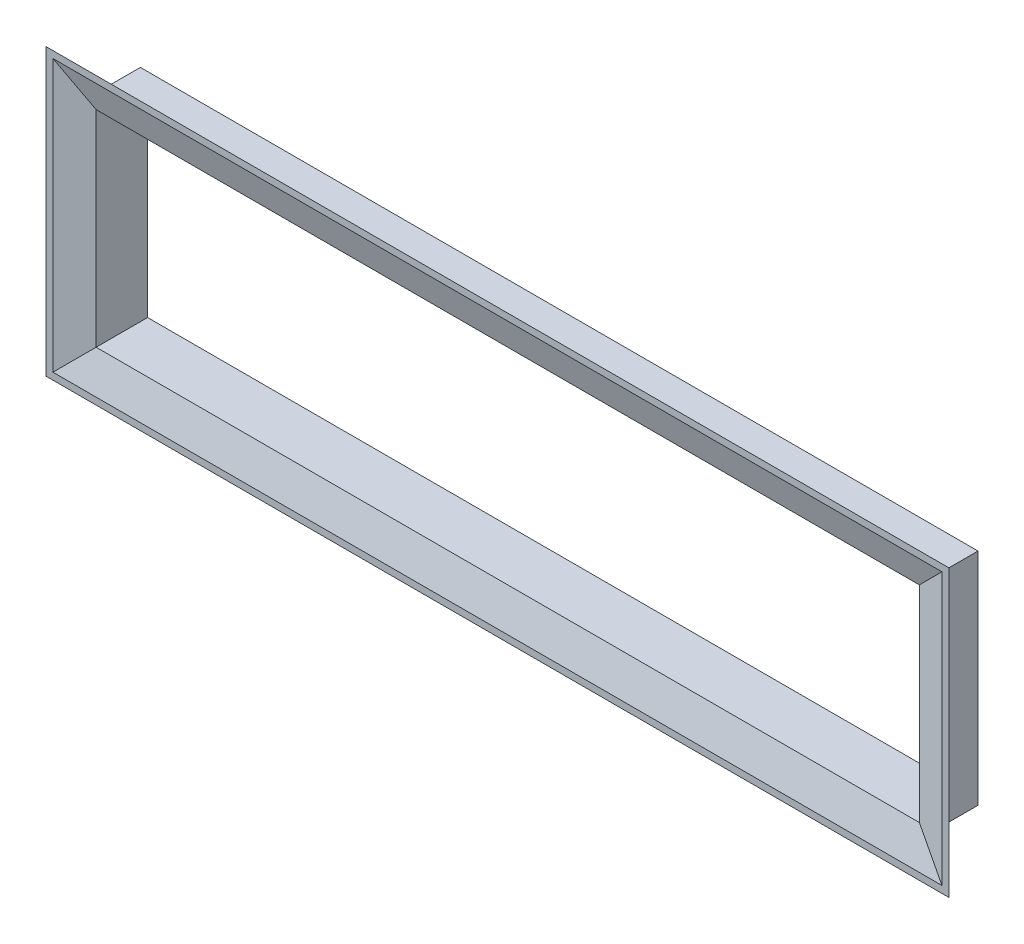
ISO-10303-21;
HEADER;
FILE_DESCRIPTION(('STEP AP214'),'2;1');
FILE_NAME('part.step','',(''),(''),'','','');
FILE_SCHEMA(('AUTOMOTIVE_DESIGN { 1 0 10303 214 1 1 1 1 }'));
ENDSEC;
DATA;
#1=APPLICATION_CONTEXT('core data for automotive mechanical design processes');
#2=APPLICATION_PROTOCOL_DEFINITION('international standard','automotive_design',2000,#1);
#3=PRODUCT_CONTEXT('',#1,'mechanical');
#4=PRODUCT('Part','Part','',(#3));
#5=PRODUCT_RELATED_PRODUCT_CATEGORY('part','',(#4));
#6=PRODUCT_DEFINITION_FORMATION('','',#4);
#7=PRODUCT_DEFINITION_CONTEXT('part definition',#1,'design');
#8=PRODUCT_DEFINITION('design','',#6,#7);
#9=PRODUCT_DEFINITION_SHAPE('','',#8);
#10=(LENGTH_UNIT() NAMED_UNIT(*) SI_UNIT(.MILLI.,.METRE.));
#11=(NAMED_UNIT(*) PLANE_ANGLE_UNIT() SI_UNIT($,.RADIAN.));
#12=(NAMED_UNIT(*) SI_UNIT($,.STERADIAN.) SOLID_ANGLE_UNIT());
#13=UNCERTAINTY_MEASURE_WITH_UNIT(LENGTH_MEASURE(1.E-05),#10,'distance_accuracy_value','');
#14=(GEOMETRIC_REPRESENTATION_CONTEXT(3) GLOBAL_UNCERTAINTY_ASSIGNED_CONTEXT((#13)) GLOBAL_UNIT_ASSIGNED_CONTEXT((#10,
#11,#12)) REPRESENTATION_CONTEXT('',''));
#15=CARTESIAN_POINT('',(0.,0.,0.));
#16=DIRECTION('',(0.,0.,1.));
#17=DIRECTION('',(1.,0.,0.));
#18=AXIS2_PLACEMENT_3D('',#15,#16,#17);
#19=CARTESIAN_POINT('',(0.,0.,100.));
#20=DIRECTION('',(0.,0.,1.));
#21=DIRECTION('',(1.,0.,0.));
#22=AXIS2_PLACEMENT_3D('',#19,#20,#21);
#23=PLANE('',#22);
#24=DIRECTION('',(0.,-1.,0.));
#25=VECTOR('',#24,1.);
#26=CARTESIAN_POINT('',(-814.,214.,100.));
#27=LINE('',#26,#25);
#28=CARTESIAN_POINT('',(-814.,214.,100.));
#29=VERTEX_POINT('',#28);
#30=CARTESIAN_POINT('',(-814.,-214.,100.));
#31=VERTEX_POINT('',#30);
#32=EDGE_CURVE('E335',#29,#31,#27,.T.);
#33=ORIENTED_EDGE('',*,*,#32,.T.);
#34=DIRECTION('',(1.,0.,0.));
#35=VECTOR('',#34,1.);
#36=CARTESIAN_POINT('',(-814.,-214.,100.));
#37=LINE('',#36,#35);
#38=CARTESIAN_POINT('',(814.,-214.,100.));
#39=VERTEX_POINT('',#38);
#40=EDGE_CURVE('E338',#31,#39,#37,.T.);
#41=ORIENTED_EDGE('',*,*,#40,.T.);
#42=DIRECTION('',(0.,1.,0.));
#43=VECTOR('',#42,1.);
#44=CARTESIAN_POINT('',(814.,214.,100.));
#45=LINE('',#44,#43);
#46=CARTESIAN_POINT('',(814.,214.,100.));
#47=VERTEX_POINT('',#46);
#48=EDGE_CURVE('E341',#39,#47,#45,.T.);
#49=ORIENTED_EDGE('',*,*,#48,.T.);
#50=DIRECTION('',(-1.,0.,0.));
#51=VECTOR('',#50,1.);
#52=CARTESIAN_POINT('',(-814.,214.,100.));
#53=LINE('',#52,#51);
#54=EDGE_CURVE('E343',#47,#29,#53,.T.);
#55=ORIENTED_EDGE('',*,*,#54,.T.);
#56=EDGE_LOOP('',(#33,#41,#49,#55));
#57=FACE_BOUND('',#56,.T.);
#58=DIRECTION('',(0.,1.,0.));
#59=VECTOR('',#58,1.);
#60=CARTESIAN_POINT('',(-813.410443691392,0.,100.));
#61=LINE('',#60,#59);
#62=CARTESIAN_POINT('',(-813.410443691392,-213.410443691392,100.));
#63=VERTEX_POINT('',#62);
#64=CARTESIAN_POINT('',(-813.410443691392,213.410443691392,100.));
#65=VERTEX_POINT('',#64);
#66=EDGE_CURVE('E281',#63,#65,#61,.T.);
#67=ORIENTED_EDGE('',*,*,#66,.T.);
#68=DIRECTION('',(1.,0.,0.));
#69=VECTOR('',#68,1.);
#70=CARTESIAN_POINT('',(0.,213.410443691392,100.));
#71=LINE('',#70,#69);
#72=CARTESIAN_POINT('',(813.410443691392,213.410443691392,100.));
#73=VERTEX_POINT('',#72);
#74=EDGE_CURVE('E154',#65,#73,#71,.T.);
#75=ORIENTED_EDGE('',*,*,#74,.T.);
#76=DIRECTION('',(0.,-1.,0.));
#77=VECTOR('',#76,1.);
#78=CARTESIAN_POINT('',(813.410443691393,6.81956691527067E-13,100.));
#79=LINE('',#78,#77);
#80=CARTESIAN_POINT('',(813.410443691393,-213.410443691392,100.));
#81=VERTEX_POINT('',#80);
#82=EDGE_CURVE('E276',#73,#81,#79,.T.);
#83=ORIENTED_EDGE('',*,*,#82,.T.);
#84=DIRECTION('',(-1.,0.,0.));
#85=VECTOR('',#84,1.);
#86=CARTESIAN_POINT('',(0.,-213.410443691392,100.));
#87=LINE('',#86,#85);
#88=EDGE_CURVE('E285',#81,#63,#87,.T.);
#89=ORIENTED_EDGE('',*,*,#88,.T.);
#90=EDGE_LOOP('',(#67,#75,#83,#89));
#91=FACE_BOUND('',#90,.T.);
#92=ADVANCED_FACE('F139',(#57,#91),#23,.T.);
#93=CARTESIAN_POINT('',(0.,0.,0.));
#94=DIRECTION('',(0.,0.,1.));
#95=DIRECTION('',(1.,0.,0.));
#96=AXIS2_PLACEMENT_3D('',#93,#94,#95);
#97=PLANE('',#96);
#98=DIRECTION('',(0.,-1.,0.));
#99=VECTOR('',#98,1.);
#100=CARTESIAN_POINT('',(-814.,214.,0.));
#101=LINE('',#100,#99);
#102=CARTESIAN_POINT('',(-814.,214.,0.));
#103=VERTEX_POINT('',#102);
#104=CARTESIAN_POINT('',(-814.,-214.,0.));
#105=VERTEX_POINT('',#104);
#106=EDGE_CURVE('E334',#103,#105,#101,.T.);
#107=ORIENTED_EDGE('',*,*,#106,.F.);
#108=DIRECTION('',(-1.,0.,0.));
#109=VECTOR('',#108,1.);
#110=CARTESIAN_POINT('',(-814.,214.,0.));
#111=LINE('',#110,#109);
#112=CARTESIAN_POINT('',(814.,214.,0.));
#113=VERTEX_POINT('',#112);
#114=EDGE_CURVE('E339',#113,#103,#111,.T.);
#115=ORIENTED_EDGE('',*,*,#114,.F.);
#116=DIRECTION('',(0.,1.,0.));
#117=VECTOR('',#116,1.);
#118=CARTESIAN_POINT('',(814.,214.,0.));
#119=LINE('',#118,#117);
#120=CARTESIAN_POINT('',(814.,-214.,0.));
#121=VERTEX_POINT('',#120);
#122=EDGE_CURVE('E350',#121,#113,#119,.T.);
#123=ORIENTED_EDGE('',*,*,#122,.F.);
#124=DIRECTION('',(1.,0.,0.));
#125=VECTOR('',#124,1.);
#126=CARTESIAN_POINT('',(-814.,-214.,0.));
#127=LINE('',#126,#125);
#128=EDGE_CURVE('E348',#105,#121,#127,.T.);
#129=ORIENTED_EDGE('',*,*,#128,.F.);
#130=EDGE_LOOP('',(#107,#115,#123,#129));
#131=FACE_BOUND('',#130,.T.);
#132=DIRECTION('',(0.,1.,0.));
#133=VECTOR('',#132,1.);
#134=CARTESIAN_POINT('',(800.,200.,0.));
#135=LINE('',#134,#133);
#136=CARTESIAN_POINT('',(800.,-200.,0.));
#137=VERTEX_POINT('',#136);
#138=CARTESIAN_POINT('',(800.,200.,0.));
#139=VERTEX_POINT('',#138);
#140=EDGE_CURVE('E290',#137,#139,#135,.T.);
#141=ORIENTED_EDGE('',*,*,#140,.T.);
#142=DIRECTION('',(-1.,0.,0.));
#143=VECTOR('',#142,1.);
#144=CARTESIAN_POINT('',(-800.,200.,0.));
#145=LINE('',#144,#143);
#146=CARTESIAN_POINT('',(-800.,200.,0.));
#147=VERTEX_POINT('',#146);
#148=EDGE_CURVE('E317',#139,#147,#145,.T.);
#149=ORIENTED_EDGE('',*,*,#148,.T.);
#150=DIRECTION('',(0.,-1.,0.));
#151=VECTOR('',#150,1.);
#152=CARTESIAN_POINT('',(-800.,200.,0.));
#153=LINE('',#152,#151);
#154=CARTESIAN_POINT('',(-800.,-200.,0.));
#155=VERTEX_POINT('',#154);
#156=EDGE_CURVE('E320',#147,#155,#153,.T.);
#157=ORIENTED_EDGE('',*,*,#156,.T.);
#158=DIRECTION('',(1.,0.,0.));
#159=VECTOR('',#158,1.);
#160=CARTESIAN_POINT('',(-800.,-200.,0.));
#161=LINE('',#160,#159);
#162=EDGE_CURVE('E308',#155,#137,#161,.T.);
#163=ORIENTED_EDGE('',*,*,#162,.T.);
#164=EDGE_LOOP('',(#141,#149,#157,#163));
#165=FACE_BOUND('',#164,.T.);
#166=ADVANCED_FACE('F368',(#131,#165),#97,.F.);
#167=CARTESIAN_POINT('',(-814.,214.,100.));
#168=DIRECTION('',(1.,0.,0.));
#169=DIRECTION('',(0.,0.,-1.));
#170=AXIS2_PLACEMENT_3D('',#167,#168,#169);
#171=PLANE('',#170);
#172=ORIENTED_EDGE('',*,*,#106,.T.);
#173=DIRECTION('',(0.,0.,-1.));
#174=VECTOR('',#173,1.);
#175=CARTESIAN_POINT('',(-814.,-214.,100.));
#176=LINE('',#175,#174);
#177=EDGE_CURVE('E12',#31,#105,#176,.T.);
#178=ORIENTED_EDGE('',*,*,#177,.F.);
#179=ORIENTED_EDGE('',*,*,#32,.F.);
#180=DIRECTION('',(0.,0.,-1.));
#181=VECTOR('',#180,1.);
#182=CARTESIAN_POINT('',(-814.,214.,100.));
#183=LINE('',#182,#181);
#184=EDGE_CURVE('E345',#29,#103,#183,.T.);
#185=ORIENTED_EDGE('',*,*,#184,.T.);
#186=EDGE_LOOP('',(#172,#178,#179,#185));
#187=FACE_BOUND('',#186,.T.);
#188=ADVANCED_FACE('F141',(#187),#171,.F.);
#189=CARTESIAN_POINT('',(-814.,-214.,100.));
#190=DIRECTION('',(0.,1.,0.));
#191=DIRECTION('',(-1.,0.,0.));
#192=AXIS2_PLACEMENT_3D('',#189,#190,#191);
#193=PLANE('',#192);
#194=ORIENTED_EDGE('',*,*,#128,.T.);
#195=DIRECTION('',(0.,0.,-1.));
#196=VECTOR('',#195,1.);
#197=CARTESIAN_POINT('',(814.,-214.,100.));
#198=LINE('',#197,#196);
#199=EDGE_CURVE('E147',#39,#121,#198,.T.);
#200=ORIENTED_EDGE('',*,*,#199,.F.);
#201=ORIENTED_EDGE('',*,*,#40,.F.);
#202=ORIENTED_EDGE('',*,*,#177,.T.);
#203=EDGE_LOOP('',(#194,#200,#201,#202));
#204=FACE_BOUND('',#203,.T.);
#205=ADVANCED_FACE('F379',(#204),#193,.F.);
#206=CARTESIAN_POINT('',(814.,214.,100.));
#207=DIRECTION('',(-1.,0.,0.));
#208=DIRECTION('',(0.,-1.,0.));
#209=AXIS2_PLACEMENT_3D('',#206,#207,#208);
#210=PLANE('',#209);
#211=ORIENTED_EDGE('',*,*,#122,.T.);
#212=DIRECTION('',(0.,0.,-1.));
#213=VECTOR('',#212,1.);
#214=CARTESIAN_POINT('',(814.,214.,100.));
#215=LINE('',#214,#213);
#216=EDGE_CURVE('E355',#47,#113,#215,.T.);
#217=ORIENTED_EDGE('',*,*,#216,.F.);
#218=ORIENTED_EDGE('',*,*,#48,.F.);
#219=ORIENTED_EDGE('',*,*,#199,.T.);
#220=EDGE_LOOP('',(#211,#217,#218,#219));
#221=FACE_BOUND('',#220,.T.);
#222=ADVANCED_FACE('F362',(#221),#210,.F.);
#223=CARTESIAN_POINT('',(-814.,214.,100.));
#224=DIRECTION('',(0.,-1.,0.));
#225=DIRECTION('',(0.,0.,-1.));
#226=AXIS2_PLACEMENT_3D('',#223,#224,#225);
#227=PLANE('',#226);
#228=ORIENTED_EDGE('',*,*,#114,.T.);
#229=ORIENTED_EDGE('',*,*,#184,.F.);
#230=ORIENTED_EDGE('',*,*,#54,.F.);
#231=ORIENTED_EDGE('',*,*,#216,.T.);
#232=EDGE_LOOP('',(#228,#229,#230,#231));
#233=FACE_BOUND('',#232,.T.);
#234=ADVANCED_FACE('F372',(#233),#227,.F.);
#235=CARTESIAN_POINT('',(800.,200.,100.));
#236=DIRECTION('',(-1.,0.,0.));
#237=DIRECTION('',(0.,-1.,0.));
#238=AXIS2_PLACEMENT_3D('',#235,#236,#237);
#239=PLANE('',#238);
#240=ORIENTED_EDGE('',*,*,#140,.F.);
#241=DIRECTION('',(0.,0.,-1.));
#242=VECTOR('',#241,1.);
#243=CARTESIAN_POINT('',(800.,-200.,100.));
#244=LINE('',#243,#242);
#245=CARTESIAN_POINT('',(800.,-200.,100.));
#246=VERTEX_POINT('',#245);
#247=EDGE_CURVE('E314',#246,#137,#244,.T.);
#248=ORIENTED_EDGE('',*,*,#247,.F.);
#249=DIRECTION('',(0.,1.,0.));
#250=VECTOR('',#249,1.);
#251=CARTESIAN_POINT('',(800.,200.,100.));
#252=LINE('',#251,#250);
#253=CARTESIAN_POINT('',(800.,200.,100.));
#254=VERTEX_POINT('',#253);
#255=EDGE_CURVE('E304',#246,#254,#252,.T.);
#256=ORIENTED_EDGE('',*,*,#255,.T.);
#257=DIRECTION('',(0.,0.,-1.));
#258=VECTOR('',#257,1.);
#259=CARTESIAN_POINT('',(800.,200.,100.));
#260=LINE('',#259,#258);
#261=EDGE_CURVE('E331',#254,#139,#260,.T.);
#262=ORIENTED_EDGE('',*,*,#261,.T.);
#263=EDGE_LOOP('',(#240,#248,#256,#262));
#264=FACE_BOUND('',#263,.T.);
#265=ADVANCED_FACE('F393',(#264),#239,.T.);
#266=CARTESIAN_POINT('',(-800.,200.,100.));
#267=DIRECTION('',(0.,-1.,0.));
#268=DIRECTION('',(0.,0.,-1.));
#269=AXIS2_PLACEMENT_3D('',#266,#267,#268);
#270=PLANE('',#269);
#271=ORIENTED_EDGE('',*,*,#148,.F.);
#272=ORIENTED_EDGE('',*,*,#261,.F.);
#273=DIRECTION('',(-1.,0.,0.));
#274=VECTOR('',#273,1.);
#275=CARTESIAN_POINT('',(-800.,200.,100.));
#276=LINE('',#275,#274);
#277=CARTESIAN_POINT('',(-800.,200.,100.));
#278=VERTEX_POINT('',#277);
#279=EDGE_CURVE('E307',#254,#278,#276,.T.);
#280=ORIENTED_EDGE('',*,*,#279,.T.);
#281=DIRECTION('',(0.,0.,-1.));
#282=VECTOR('',#281,1.);
#283=CARTESIAN_POINT('',(-800.,200.,100.));
#284=LINE('',#283,#282);
#285=EDGE_CURVE('E329',#278,#147,#284,.T.);
#286=ORIENTED_EDGE('',*,*,#285,.T.);
#287=EDGE_LOOP('',(#271,#272,#280,#286));
#288=FACE_BOUND('',#287,.T.);
#289=ADVANCED_FACE('F400',(#288),#270,.T.);
#290=CARTESIAN_POINT('',(-800.,200.,100.));
#291=DIRECTION('',(1.,0.,0.));
#292=DIRECTION('',(0.,0.,-1.));
#293=AXIS2_PLACEMENT_3D('',#290,#291,#292);
#294=PLANE('',#293);
#295=ORIENTED_EDGE('',*,*,#156,.F.);
#296=ORIENTED_EDGE('',*,*,#285,.F.);
#297=DIRECTION('',(0.,-1.,0.));
#298=VECTOR('',#297,1.);
#299=CARTESIAN_POINT('',(-800.,200.,100.));
#300=LINE('',#299,#298);
#301=CARTESIAN_POINT('',(-800.,-200.,100.));
#302=VERTEX_POINT('',#301);
#303=EDGE_CURVE('E245',#278,#302,#300,.T.);
#304=ORIENTED_EDGE('',*,*,#303,.T.);
#305=DIRECTION('',(0.,0.,-1.));
#306=VECTOR('',#305,1.);
#307=CARTESIAN_POINT('',(-800.,-200.,100.));
#308=LINE('',#307,#306);
#309=EDGE_CURVE('E327',#302,#155,#308,.T.);
#310=ORIENTED_EDGE('',*,*,#309,.T.);
#311=EDGE_LOOP('',(#295,#296,#304,#310));
#312=FACE_BOUND('',#311,.T.);
#313=ADVANCED_FACE('F405',(#312),#294,.T.);
#314=CARTESIAN_POINT('',(-800.,-200.,100.));
#315=DIRECTION('',(0.,1.,0.));
#316=DIRECTION('',(0.,0.,1.));
#317=AXIS2_PLACEMENT_3D('',#314,#315,#316);
#318=PLANE('',#317);
#319=ORIENTED_EDGE('',*,*,#162,.F.);
#320=ORIENTED_EDGE('',*,*,#309,.F.);
#321=DIRECTION('',(1.,0.,0.));
#322=VECTOR('',#321,1.);
#323=CARTESIAN_POINT('',(-800.,-200.,100.));
#324=LINE('',#323,#322);
#325=EDGE_CURVE('E311',#302,#246,#324,.T.);
#326=ORIENTED_EDGE('',*,*,#325,.T.);
#327=ORIENTED_EDGE('',*,*,#247,.T.);
#328=EDGE_LOOP('',(#319,#320,#326,#327));
#329=FACE_BOUND('',#328,.T.);
#330=ADVANCED_FACE('F411',(#329),#318,.T.);
#331=CARTESIAN_POINT('',(0.,0.,120.));
#332=DIRECTION('',(0.,0.,-1.));
#333=DIRECTION('',(-1.,0.,0.));
#334=AXIS2_PLACEMENT_3D('',#331,#332,#333);
#335=PLANE('',#334);
#336=DIRECTION('',(0.,-1.,0.));
#337=VECTOR('',#336,1.);
#338=CARTESIAN_POINT('',(-864.,0.,120.));
#339=LINE('',#338,#337);
#340=CARTESIAN_POINT('',(-864.,264.,120.));
#341=VERTEX_POINT('',#340);
#342=CARTESIAN_POINT('',(-864.,-264.,120.));
#343=VERTEX_POINT('',#342);
#344=EDGE_CURVE('E243',#341,#343,#339,.T.);
#345=ORIENTED_EDGE('',*,*,#344,.F.);
#346=DIRECTION('',(1.,0.,0.));
#347=VECTOR('',#346,1.);
#348=CARTESIAN_POINT('',(0.,264.,120.));
#349=LINE('',#348,#347);
#350=CARTESIAN_POINT('',(864.,264.,120.));
#351=VERTEX_POINT('',#350);
#352=EDGE_CURVE('E252',#341,#351,#349,.T.);
#353=ORIENTED_EDGE('',*,*,#352,.T.);
#354=DIRECTION('',(0.,-1.,0.));
#355=VECTOR('',#354,1.);
#356=CARTESIAN_POINT('',(864.,0.,120.));
#357=LINE('',#356,#355);
#358=CARTESIAN_POINT('',(864.,-264.,120.));
#359=VERTEX_POINT('',#358);
#360=EDGE_CURVE('E270',#351,#359,#357,.T.);
#361=ORIENTED_EDGE('',*,*,#360,.T.);
#362=DIRECTION('',(1.,0.,0.));
#363=VECTOR('',#362,1.);
#364=CARTESIAN_POINT('',(0.,-264.,120.));
#365=LINE('',#364,#363);
#366=EDGE_CURVE('E263',#343,#359,#365,.T.);
#367=ORIENTED_EDGE('',*,*,#366,.F.);
#368=EDGE_LOOP('',(#345,#353,#361,#367));
#369=FACE_BOUND('',#368,.T.);
#370=DIRECTION('',(1.,0.,0.));
#371=VECTOR('',#370,1.);
#372=CARTESIAN_POINT('',(0.,277.410443691392,120.));
#373=LINE('',#372,#371);
#374=CARTESIAN_POINT('',(-877.410443691392,277.410443691392,120.));
#375=VERTEX_POINT('',#374);
#376=CARTESIAN_POINT('',(877.410443691392,277.410443691392,120.));
#377=VERTEX_POINT('',#376);
#378=EDGE_CURVE('E291',#375,#377,#373,.T.);
#379=ORIENTED_EDGE('',*,*,#378,.F.);
#380=DIRECTION('',(0.,-1.,0.));
#381=VECTOR('',#380,1.);
#382=CARTESIAN_POINT('',(-877.410443691392,0.,120.));
#383=LINE('',#382,#381);
#384=CARTESIAN_POINT('',(-877.410443691392,-277.410443691392,120.));
#385=VERTEX_POINT('',#384);
#386=EDGE_CURVE('E257',#375,#385,#383,.T.);
#387=ORIENTED_EDGE('',*,*,#386,.T.);
#388=DIRECTION('',(1.,0.,0.));
#389=VECTOR('',#388,1.);
#390=CARTESIAN_POINT('',(0.,-277.410443691392,120.));
#391=LINE('',#390,#389);
#392=CARTESIAN_POINT('',(877.410443691392,-277.410443691392,120.));
#393=VERTEX_POINT('',#392);
#394=EDGE_CURVE('E286',#385,#393,#391,.T.);
#395=ORIENTED_EDGE('',*,*,#394,.T.);
#396=DIRECTION('',(0.,-1.,0.));
#397=VECTOR('',#396,1.);
#398=CARTESIAN_POINT('',(877.410443691392,7.356137703072E-13,120.));
#399=LINE('',#398,#397);
#400=EDGE_CURVE('E277',#377,#393,#399,.T.);
#401=ORIENTED_EDGE('',*,*,#400,.F.);
#402=EDGE_LOOP('',(#379,#387,#395,#401));
#403=FACE_BOUND('',#402,.T.);
#404=ADVANCED_FACE('F260',(#369,#403),#335,.F.);
#405=CARTESIAN_POINT('',(0.,-9.4830566110861,30.3457811554755));
#406=DIRECTION('',(0.,-0.298274993135947,0.95447997803503));
#407=DIRECTION('',(0.,-0.95447997803503,-0.298274993135947));
#408=AXIS2_PLACEMENT_3D('',#405,#406,#407);
#409=PLANE('',#408);
#410=DIRECTION('',(0.690450963203361,0.690450963203368,0.215765926001052));
#411=VECTOR('',#410,1.);
#412=CARTESIAN_POINT('',(309.004210600162,-290.995789399843,-57.626947841011));
#413=LINE('',#412,#411);
#414=EDGE_CURVE('E273',#73,#377,#413,.T.);
#415=ORIENTED_EDGE('',*,*,#414,.F.);
#416=ORIENTED_EDGE('',*,*,#74,.F.);
#417=DIRECTION('',(-0.690450963203366,0.690450963203364,0.215765926001051));
#418=VECTOR('',#417,1.);
#419=CARTESIAN_POINT('',(-309.004210600157,-290.995789399842,-57.6269478410106));
#420=LINE('',#419,#418);
#421=EDGE_CURVE('E278',#65,#375,#420,.T.);
#422=ORIENTED_EDGE('',*,*,#421,.T.);
#423=ORIENTED_EDGE('',*,*,#378,.T.);
#424=EDGE_LOOP('',(#415,#416,#422,#423));
#425=FACE_BOUND('',#424,.T.);
#426=ADVANCED_FACE('F435',(#425),#409,.F.);
#427=CARTESIAN_POINT('',(43.8977263070643,0.,-140.472724182605));
#428=DIRECTION('',(-0.298274993135949,0.,0.954479978035029));
#429=DIRECTION('',(0.954479978035029,0.,0.298274993135949));
#430=AXIS2_PLACEMENT_3D('',#427,#428,#429);
#431=PLANE('',#430);
#432=DIRECTION('',(0.690450963203362,-0.690450963203368,0.215765926001052));
#433=VECTOR('',#432,1.);
#434=CARTESIAN_POINT('',(309.004210600162,290.995789399843,-57.6269478410108));
#435=LINE('',#434,#433);
#436=EDGE_CURVE('E282',#81,#393,#435,.T.);
#437=ORIENTED_EDGE('',*,*,#436,.F.);
#438=ORIENTED_EDGE('',*,*,#82,.F.);
#439=ORIENTED_EDGE('',*,*,#414,.T.);
#440=ORIENTED_EDGE('',*,*,#400,.T.);
#441=EDGE_LOOP('',(#437,#438,#439,#440));
#442=FACE_BOUND('',#441,.T.);
#443=ADVANCED_FACE('F438',(#442),#431,.F.);
#444=CARTESIAN_POINT('',(0.,9.48305661108612,30.3457811554756));
#445=DIRECTION('',(0.,0.298274993135947,0.95447997803503));
#446=DIRECTION('',(0.,-0.95447997803503,0.298274993135947));
#447=AXIS2_PLACEMENT_3D('',#444,#445,#446);
#448=PLANE('',#447);
#449=DIRECTION('',(-0.690450963203365,-0.690450963203364,0.215765926001051));
#450=VECTOR('',#449,1.);
#451=CARTESIAN_POINT('',(-309.004210600157,290.995789399842,-57.6269478410105));
#452=LINE('',#451,#450);
#453=EDGE_CURVE('E280',#63,#385,#452,.T.);
#454=ORIENTED_EDGE('',*,*,#453,.F.);
#455=ORIENTED_EDGE('',*,*,#88,.F.);
#456=ORIENTED_EDGE('',*,*,#436,.T.);
#457=ORIENTED_EDGE('',*,*,#394,.F.);
#458=EDGE_LOOP('',(#454,#455,#456,#457));
#459=FACE_BOUND('',#458,.T.);
#460=ADVANCED_FACE('F441',(#459),#448,.F.);
#461=CARTESIAN_POINT('',(-43.8977263070631,0.,-140.472724182602));
#462=DIRECTION('',(0.298274993135946,0.,0.95447997803503));
#463=DIRECTION('',(0.95447997803503,0.,-0.298274993135946));
#464=AXIS2_PLACEMENT_3D('',#461,#462,#463);
#465=PLANE('',#464);
#466=ORIENTED_EDGE('',*,*,#421,.F.);
#467=ORIENTED_EDGE('',*,*,#66,.F.);
#468=ORIENTED_EDGE('',*,*,#453,.T.);
#469=ORIENTED_EDGE('',*,*,#386,.F.);
#470=EDGE_LOOP('',(#466,#467,#468,#469));
#471=FACE_BOUND('',#470,.T.);
#472=ADVANCED_FACE('F432',(#471),#465,.F.);
#473=CARTESIAN_POINT('',(0.,-10.6761565836299,34.1637010676156));
#474=DIRECTION('',(0.,-0.298274993135947,0.95447997803503));
#475=DIRECTION('',(0.,-0.95447997803503,-0.298274993135947));
#476=AXIS2_PLACEMENT_3D('',#473,#474,#475);
#477=PLANE('',#476);
#478=DIRECTION('',(0.690450963203361,0.690450963203368,0.215765926001053));
#479=VECTOR('',#478,1.);
#480=CARTESIAN_POINT('',(800.,200.,100.));
#481=LINE('',#480,#479);
#482=EDGE_CURVE('E254',#254,#351,#481,.T.);
#483=ORIENTED_EDGE('',*,*,#482,.T.);
#484=ORIENTED_EDGE('',*,*,#352,.F.);
#485=DIRECTION('',(-0.690450963203366,0.690450963203364,0.215765926001051));
#486=VECTOR('',#485,1.);
#487=CARTESIAN_POINT('',(-800.,200.,100.));
#488=LINE('',#487,#486);
#489=EDGE_CURVE('E239',#278,#341,#488,.T.);
#490=ORIENTED_EDGE('',*,*,#489,.F.);
#491=ORIENTED_EDGE('',*,*,#279,.F.);
#492=EDGE_LOOP('',(#483,#484,#490,#491));
#493=FACE_BOUND('',#492,.T.);
#494=ADVANCED_FACE('F253',(#493),#477,.T.);
#495=CARTESIAN_POINT('',(42.7046263345205,0.,-136.654804270465));
#496=DIRECTION('',(-0.298274993135949,0.,0.954479978035029));
#497=DIRECTION('',(0.954479978035029,0.,0.298274993135949));
#498=AXIS2_PLACEMENT_3D('',#495,#496,#497);
#499=PLANE('',#498);
#500=DIRECTION('',(0.690450963203362,-0.690450963203368,0.215765926001052));
#501=VECTOR('',#500,1.);
#502=CARTESIAN_POINT('',(800.,-200.,100.));
#503=LINE('',#502,#501);
#504=EDGE_CURVE('E268',#246,#359,#503,.T.);
#505=ORIENTED_EDGE('',*,*,#504,.T.);
#506=ORIENTED_EDGE('',*,*,#360,.F.);
#507=ORIENTED_EDGE('',*,*,#482,.F.);
#508=ORIENTED_EDGE('',*,*,#255,.F.);
#509=EDGE_LOOP('',(#505,#506,#507,#508));
#510=FACE_BOUND('',#509,.T.);
#511=ADVANCED_FACE('F418',(#510),#499,.T.);
#512=CARTESIAN_POINT('',(0.,10.6761565836299,34.1637010676158));
#513=DIRECTION('',(0.,0.298274993135947,0.95447997803503));
#514=DIRECTION('',(0.,-0.95447997803503,0.298274993135947));
#515=AXIS2_PLACEMENT_3D('',#512,#513,#514);
#516=PLANE('',#515);
#517=DIRECTION('',(-0.690450963203365,-0.690450963203365,0.215765926001051));
#518=VECTOR('',#517,1.);
#519=CARTESIAN_POINT('',(-800.,-200.,100.));
#520=LINE('',#519,#518);
#521=EDGE_CURVE('E162',#302,#343,#520,.T.);
#522=ORIENTED_EDGE('',*,*,#521,.T.);
#523=ORIENTED_EDGE('',*,*,#366,.T.);
#524=ORIENTED_EDGE('',*,*,#504,.F.);
#525=ORIENTED_EDGE('',*,*,#325,.F.);
#526=EDGE_LOOP('',(#522,#523,#524,#525));
#527=FACE_BOUND('',#526,.T.);
#528=ADVANCED_FACE('F420',(#527),#516,.T.);
#529=CARTESIAN_POINT('',(-42.7046263345193,0.,-136.654804270462));
#530=DIRECTION('',(0.298274993135946,0.,0.95447997803503));
#531=DIRECTION('',(0.95447997803503,0.,-0.298274993135946));
#532=AXIS2_PLACEMENT_3D('',#529,#530,#531);
#533=PLANE('',#532);
#534=ORIENTED_EDGE('',*,*,#489,.T.);
#535=ORIENTED_EDGE('',*,*,#344,.T.);
#536=ORIENTED_EDGE('',*,*,#521,.F.);
#537=ORIENTED_EDGE('',*,*,#303,.F.);
#538=EDGE_LOOP('',(#534,#535,#536,#537));
#539=FACE_BOUND('',#538,.T.);
#540=ADVANCED_FACE('F241',(#539),#533,.T.);
#541=CLOSED_SHELL('',(#92,#166,#188,#205,#222,#234,#265,#289,#313,#330,#404,#426,#443,#460,#472,
#494,#511,#528,#540));
#542=MANIFOLD_SOLID_BREP('B2',#541);
#543=ADVANCED_BREP_SHAPE_REPRESENTATION('',(#18,#542),#14);
#544=SHAPE_DEFINITION_REPRESENTATION(#9,#543);
ENDSEC;
END-ISO-10303-21;
